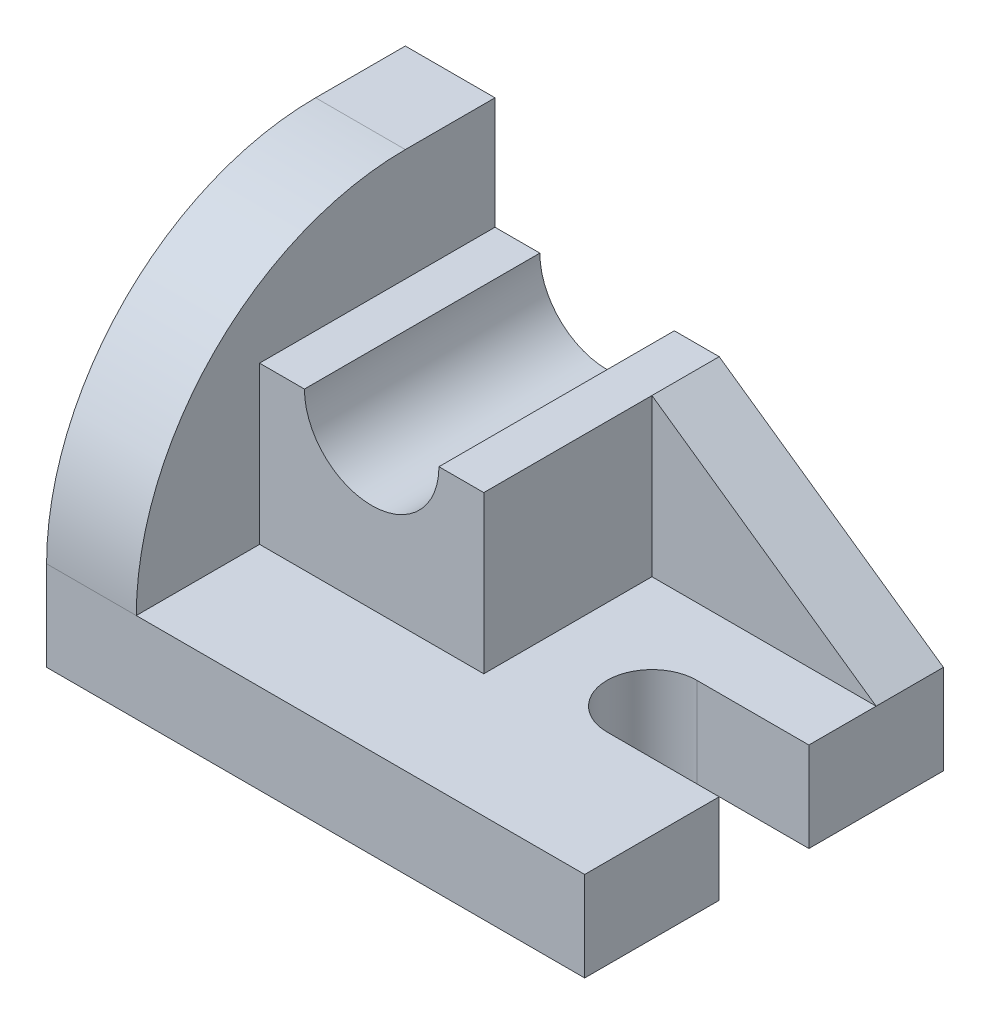
ISO-10303-21;
HEADER;
FILE_DESCRIPTION(('STEP AP214'),'2;1');
FILE_NAME('part.step','',(''),(''),'','','');
FILE_SCHEMA(('AUTOMOTIVE_DESIGN { 1 0 10303 214 1 1 1 1 }'));
ENDSEC;
DATA;
#1=APPLICATION_CONTEXT('core data for automotive mechanical design processes');
#2=APPLICATION_PROTOCOL_DEFINITION('international standard','automotive_design',2000,#1);
#3=PRODUCT_CONTEXT('',#1,'mechanical');
#4=PRODUCT('Part','Part','',(#3));
#5=PRODUCT_RELATED_PRODUCT_CATEGORY('part','',(#4));
#6=PRODUCT_DEFINITION_FORMATION('','',#4);
#7=PRODUCT_DEFINITION_CONTEXT('part definition',#1,'design');
#8=PRODUCT_DEFINITION('design','',#6,#7);
#9=PRODUCT_DEFINITION_SHAPE('','',#8);
#10=(LENGTH_UNIT() NAMED_UNIT(*) SI_UNIT(.MILLI.,.METRE.));
#11=(NAMED_UNIT(*) PLANE_ANGLE_UNIT() SI_UNIT($,.RADIAN.));
#12=(NAMED_UNIT(*) SI_UNIT($,.STERADIAN.) SOLID_ANGLE_UNIT());
#13=UNCERTAINTY_MEASURE_WITH_UNIT(LENGTH_MEASURE(1.E-05),#10,'distance_accuracy_value','');
#14=(GEOMETRIC_REPRESENTATION_CONTEXT(3) GLOBAL_UNCERTAINTY_ASSIGNED_CONTEXT((#13)) GLOBAL_UNIT_ASSIGNED_CONTEXT((#10,
#11,#12)) REPRESENTATION_CONTEXT('',''));
#15=CARTESIAN_POINT('',(0.,0.,0.));
#16=DIRECTION('',(0.,0.,1.));
#17=DIRECTION('',(1.,0.,0.));
#18=AXIS2_PLACEMENT_3D('',#15,#16,#17);
#19=CARTESIAN_POINT('',(0.,16.,0.));
#20=DIRECTION('',(0.,1.,0.));
#21=DIRECTION('',(0.,0.,1.));
#22=AXIS2_PLACEMENT_3D('',#19,#20,#21);
#23=PLANE('',#22);
#24=DIRECTION('',(0.,0.,1.));
#25=VECTOR('',#24,1.);
#26=CARTESIAN_POINT('',(48.,16.,0.));
#27=LINE('',#26,#25);
#28=CARTESIAN_POINT('',(48.,16.,-20.));
#29=VERTEX_POINT('',#28);
#30=CARTESIAN_POINT('',(48.,16.,-8.));
#31=VERTEX_POINT('',#30);
#32=EDGE_CURVE('E220',#29,#31,#27,.T.);
#33=ORIENTED_EDGE('',*,*,#32,.F.);
#34=DIRECTION('',(-1.,0.,0.));
#35=VECTOR('',#34,1.);
#36=CARTESIAN_POINT('',(8.,16.,-20.));
#37=LINE('',#36,#35);
#38=CARTESIAN_POINT('',(8.,16.,-20.));
#39=VERTEX_POINT('',#38);
#40=EDGE_CURVE('E206',#29,#39,#37,.T.);
#41=ORIENTED_EDGE('',*,*,#40,.T.);
#42=DIRECTION('',(0.,0.,1.));
#43=VECTOR('',#42,1.);
#44=CARTESIAN_POINT('',(8.,16.,-32.));
#45=LINE('',#44,#43);
#46=CARTESIAN_POINT('',(8.,16.,10.));
#47=VERTEX_POINT('',#46);
#48=EDGE_CURVE('E346',#39,#47,#45,.T.);
#49=ORIENTED_EDGE('',*,*,#48,.T.);
#50=DIRECTION('',(-1.,0.,0.));
#51=VECTOR('',#50,1.);
#52=CARTESIAN_POINT('',(8.,16.,10.));
#53=LINE('',#52,#51);
#54=CARTESIAN_POINT('',(-32.,16.,10.));
#55=VERTEX_POINT('',#54);
#56=EDGE_CURVE('E358',#47,#55,#53,.T.);
#57=ORIENTED_EDGE('',*,*,#56,.T.);
#58=DIRECTION('',(0.,0.,1.));
#59=VECTOR('',#58,1.);
#60=CARTESIAN_POINT('',(-32.,16.,-32.));
#61=LINE('',#60,#59);
#62=CARTESIAN_POINT('',(-32.,16.,32.));
#63=VERTEX_POINT('',#62);
#64=EDGE_CURVE('E300',#55,#63,#61,.T.);
#65=ORIENTED_EDGE('',*,*,#64,.T.);
#66=DIRECTION('',(1.,0.,0.));
#67=VECTOR('',#66,1.);
#68=CARTESIAN_POINT('',(0.,16.,32.));
#69=LINE('',#68,#67);
#70=CARTESIAN_POINT('',(48.,16.,32.));
#71=VERTEX_POINT('',#70);
#72=EDGE_CURVE('E229',#63,#71,#69,.T.);
#73=ORIENTED_EDGE('',*,*,#72,.T.);
#74=CARTESIAN_POINT('',(48.,16.,8.));
#75=VERTEX_POINT('',#74);
#76=EDGE_CURVE('E221',#75,#71,#27,.T.);
#77=ORIENTED_EDGE('',*,*,#76,.F.);
#78=DIRECTION('',(-1.,0.,0.));
#79=VECTOR('',#78,1.);
#80=CARTESIAN_POINT('',(0.,16.,8.00000000000001));
#81=LINE('',#80,#79);
#82=CARTESIAN_POINT('',(28.,16.,8.));
#83=VERTEX_POINT('',#82);
#84=EDGE_CURVE('E232',#75,#83,#81,.T.);
#85=ORIENTED_EDGE('',*,*,#84,.T.);
#86=CARTESIAN_POINT('',(28.,16.,0.));
#87=DIRECTION('',(0.,1.,0.));
#88=DIRECTION('',(0.,0.,1.));
#89=AXIS2_PLACEMENT_3D('',#86,#87,#88);
#90=CIRCLE('',#89,8.);
#91=CARTESIAN_POINT('',(28.,16.,-8.));
#92=VERTEX_POINT('',#91);
#93=EDGE_CURVE('E264',#92,#83,#90,.T.);
#94=ORIENTED_EDGE('',*,*,#93,.F.);
#95=DIRECTION('',(-1.,0.,0.));
#96=VECTOR('',#95,1.);
#97=CARTESIAN_POINT('',(0.,16.,-8.));
#98=LINE('',#97,#96);
#99=EDGE_CURVE('E219',#31,#92,#98,.T.);
#100=ORIENTED_EDGE('',*,*,#99,.F.);
#101=EDGE_LOOP('',(#33,#41,#49,#57,#65,#73,#77,#85,#94,#100));
#102=FACE_BOUND('',#101,.T.);
#103=ADVANCED_FACE('F81',(#102),#23,.T.);
#104=CARTESIAN_POINT('',(8.,44.,-32.));
#105=DIRECTION('',(0.,-1.,0.));
#106=DIRECTION('',(0.,0.,-1.));
#107=AXIS2_PLACEMENT_3D('',#104,#105,#106);
#108=PLANE('',#107);
#109=DIRECTION('',(-1.,0.,0.));
#110=VECTOR('',#109,1.);
#111=CARTESIAN_POINT('',(8.,44.,-32.));
#112=LINE('',#111,#110);
#113=CARTESIAN_POINT('',(8.,44.,-32.));
#114=VERTEX_POINT('',#113);
#115=CARTESIAN_POINT('',(0.,44.,-32.));
#116=VERTEX_POINT('',#115);
#117=EDGE_CURVE('E334',#114,#116,#112,.T.);
#118=ORIENTED_EDGE('',*,*,#117,.T.);
#119=DIRECTION('',(0.,0.,1.));
#120=VECTOR('',#119,1.);
#121=CARTESIAN_POINT('',(0.,44.,-59.));
#122=LINE('',#121,#120);
#123=CARTESIAN_POINT('',(0.,44.,10.));
#124=VERTEX_POINT('',#123);
#125=EDGE_CURVE('E339',#116,#124,#122,.T.);
#126=ORIENTED_EDGE('',*,*,#125,.T.);
#127=DIRECTION('',(-1.,0.,0.));
#128=VECTOR('',#127,1.);
#129=CARTESIAN_POINT('',(8.,44.,10.));
#130=LINE('',#129,#128);
#131=CARTESIAN_POINT('',(8.,44.,10.));
#132=VERTEX_POINT('',#131);
#133=EDGE_CURVE('E356',#132,#124,#130,.T.);
#134=ORIENTED_EDGE('',*,*,#133,.F.);
#135=DIRECTION('',(0.,0.,1.));
#136=VECTOR('',#135,1.);
#137=CARTESIAN_POINT('',(8.,44.,-32.));
#138=LINE('',#137,#136);
#139=CARTESIAN_POINT('',(8.,44.,-20.));
#140=VERTEX_POINT('',#139);
#141=EDGE_CURVE('E341',#140,#132,#138,.T.);
#142=ORIENTED_EDGE('',*,*,#141,.F.);
#143=EDGE_CURVE('E204',#114,#140,#138,.T.);
#144=ORIENTED_EDGE('',*,*,#143,.F.);
#145=EDGE_LOOP('',(#118,#126,#134,#142,#144));
#146=FACE_BOUND('',#145,.T.);
#147=ADVANCED_FACE('F380',(#146),#108,.F.);
#148=CARTESIAN_POINT('',(28.,16.,0.));
#149=DIRECTION('',(0.,-1.,0.));
#150=DIRECTION('',(0.,0.,-1.));
#151=AXIS2_PLACEMENT_3D('',#148,#149,#150);
#152=CYLINDRICAL_SURFACE('',#151,8.);
#153=CARTESIAN_POINT('',(28.,0.,0.));
#154=DIRECTION('',(0.,1.,0.));
#155=DIRECTION('',(0.,0.,1.));
#156=AXIS2_PLACEMENT_3D('',#153,#154,#155);
#157=CIRCLE('',#156,8.);
#158=CARTESIAN_POINT('',(28.,0.,-8.));
#159=VERTEX_POINT('',#158);
#160=CARTESIAN_POINT('',(28.,0.,8.));
#161=VERTEX_POINT('',#160);
#162=EDGE_CURVE('E241',#159,#161,#157,.T.);
#163=ORIENTED_EDGE('',*,*,#162,.F.);
#164=DIRECTION('',(0.,-1.,0.));
#165=VECTOR('',#164,1.);
#166=CARTESIAN_POINT('',(28.,16.,-8.));
#167=LINE('',#166,#165);
#168=EDGE_CURVE('E280',#92,#159,#167,.T.);
#169=ORIENTED_EDGE('',*,*,#168,.F.);
#170=ORIENTED_EDGE('',*,*,#93,.T.);
#171=DIRECTION('',(0.,-1.,0.));
#172=VECTOR('',#171,1.);
#173=CARTESIAN_POINT('',(28.,16.,8.));
#174=LINE('',#173,#172);
#175=EDGE_CURVE('E237',#83,#161,#174,.T.);
#176=ORIENTED_EDGE('',*,*,#175,.T.);
#177=EDGE_LOOP('',(#163,#169,#170,#176));
#178=FACE_BOUND('',#177,.T.);
#179=ADVANCED_FACE('F392',(#178),#152,.F.);
#180=CARTESIAN_POINT('',(0.,16.,-8.));
#181=DIRECTION('',(0.,0.,1.));
#182=DIRECTION('',(1.,0.,0.));
#183=AXIS2_PLACEMENT_3D('',#180,#181,#182);
#184=PLANE('',#183);
#185=DIRECTION('',(-1.,0.,0.));
#186=VECTOR('',#185,1.);
#187=CARTESIAN_POINT('',(0.,0.,-8.));
#188=LINE('',#187,#186);
#189=CARTESIAN_POINT('',(48.,0.,-8.));
#190=VERTEX_POINT('',#189);
#191=EDGE_CURVE('E248',#190,#159,#188,.T.);
#192=ORIENTED_EDGE('',*,*,#191,.F.);
#193=DIRECTION('',(0.,-1.,0.));
#194=VECTOR('',#193,1.);
#195=CARTESIAN_POINT('',(48.,16.,-8.));
#196=LINE('',#195,#194);
#197=EDGE_CURVE('E274',#31,#190,#196,.T.);
#198=ORIENTED_EDGE('',*,*,#197,.F.);
#199=ORIENTED_EDGE('',*,*,#99,.T.);
#200=ORIENTED_EDGE('',*,*,#168,.T.);
#201=EDGE_LOOP('',(#192,#198,#199,#200));
#202=FACE_BOUND('',#201,.T.);
#203=ADVANCED_FACE('F321',(#202),#184,.T.);
#204=CARTESIAN_POINT('',(48.,16.,0.));
#205=DIRECTION('',(1.,0.,0.));
#206=DIRECTION('',(0.,0.,-1.));
#207=AXIS2_PLACEMENT_3D('',#204,#205,#206);
#208=PLANE('',#207);
#209=DIRECTION('',(0.,0.,1.));
#210=VECTOR('',#209,1.);
#211=CARTESIAN_POINT('',(48.,0.,0.));
#212=LINE('',#211,#210);
#213=CARTESIAN_POINT('',(48.,0.,-32.));
#214=VERTEX_POINT('',#213);
#215=EDGE_CURVE('E246',#214,#190,#212,.T.);
#216=ORIENTED_EDGE('',*,*,#215,.F.);
#217=DIRECTION('',(0.,-1.,0.));
#218=VECTOR('',#217,1.);
#219=CARTESIAN_POINT('',(48.,16.,-32.));
#220=LINE('',#219,#218);
#221=CARTESIAN_POINT('',(48.,16.,-32.));
#222=VERTEX_POINT('',#221);
#223=EDGE_CURVE('E226',#222,#214,#220,.T.);
#224=ORIENTED_EDGE('',*,*,#223,.F.);
#225=EDGE_CURVE('E203',#222,#29,#27,.T.);
#226=ORIENTED_EDGE('',*,*,#225,.T.);
#227=ORIENTED_EDGE('',*,*,#32,.T.);
#228=ORIENTED_EDGE('',*,*,#197,.T.);
#229=EDGE_LOOP('',(#216,#224,#226,#227,#228));
#230=FACE_BOUND('',#229,.T.);
#231=ADVANCED_FACE('F230',(#230),#208,.T.);
#232=CARTESIAN_POINT('',(0.,16.,-32.));
#233=DIRECTION('',(0.,0.,-1.));
#234=DIRECTION('',(-1.,0.,0.));
#235=AXIS2_PLACEMENT_3D('',#232,#233,#234);
#236=PLANE('',#235);
#237=DIRECTION('',(0.819231920519041,-0.573462344363328,0.));
#238=VECTOR('',#237,1.);
#239=CARTESIAN_POINT('',(8.,44.,-32.));
#240=LINE('',#239,#238);
#241=EDGE_CURVE('E332',#114,#222,#240,.T.);
#242=ORIENTED_EDGE('',*,*,#241,.T.);
#243=ORIENTED_EDGE('',*,*,#223,.T.);
#244=DIRECTION('',(1.,0.,0.));
#245=VECTOR('',#244,1.);
#246=CARTESIAN_POINT('',(0.,0.,-32.));
#247=LINE('',#246,#245);
#248=CARTESIAN_POINT('',(-48.,0.,-32.));
#249=VERTEX_POINT('',#248);
#250=EDGE_CURVE('E251',#249,#214,#247,.T.);
#251=ORIENTED_EDGE('',*,*,#250,.F.);
#252=DIRECTION('',(0.,-1.,0.));
#253=VECTOR('',#252,1.);
#254=CARTESIAN_POINT('',(-48.,16.,-32.));
#255=LINE('',#254,#253);
#256=CARTESIAN_POINT('',(-48.,64.,-32.));
#257=VERTEX_POINT('',#256);
#258=EDGE_CURVE('E275',#257,#249,#255,.T.);
#259=ORIENTED_EDGE('',*,*,#258,.F.);
#260=DIRECTION('',(-1.,0.,0.));
#261=VECTOR('',#260,1.);
#262=CARTESIAN_POINT('',(-48.,64.,-32.));
#263=LINE('',#262,#261);
#264=CARTESIAN_POINT('',(-32.,64.,-32.));
#265=VERTEX_POINT('',#264);
#266=EDGE_CURVE('E313',#265,#257,#263,.T.);
#267=ORIENTED_EDGE('',*,*,#266,.F.);
#268=DIRECTION('',(0.,1.,0.));
#269=VECTOR('',#268,1.);
#270=CARTESIAN_POINT('',(-32.,16.,-32.));
#271=LINE('',#270,#269);
#272=CARTESIAN_POINT('',(-32.,44.,-32.));
#273=VERTEX_POINT('',#272);
#274=EDGE_CURVE('E362',#273,#265,#271,.T.);
#275=ORIENTED_EDGE('',*,*,#274,.F.);
#276=CARTESIAN_POINT('',(-24.,44.,-32.));
#277=VERTEX_POINT('',#276);
#278=EDGE_CURVE('E348',#277,#273,#112,.T.);
#279=ORIENTED_EDGE('',*,*,#278,.F.);
#280=CARTESIAN_POINT('',(-12.,44.,-32.));
#281=DIRECTION('',(0.,0.,-1.));
#282=DIRECTION('',(-1.,0.,0.));
#283=AXIS2_PLACEMENT_3D('',#280,#281,#282);
#284=CIRCLE('',#283,12.);
#285=EDGE_CURVE('E108',#116,#277,#284,.T.);
#286=ORIENTED_EDGE('',*,*,#285,.F.);
#287=ORIENTED_EDGE('',*,*,#117,.F.);
#288=EDGE_LOOP('',(#242,#243,#251,#259,#267,#275,#279,#286,#287));
#289=FACE_BOUND('',#288,.T.);
#290=ADVANCED_FACE('F328',(#289),#236,.T.);
#291=CARTESIAN_POINT('',(-48.,16.,0.));
#292=DIRECTION('',(1.,0.,0.));
#293=DIRECTION('',(0.,0.,-1.));
#294=AXIS2_PLACEMENT_3D('',#291,#292,#293);
#295=PLANE('',#294);
#296=DIRECTION('',(0.,-1.,0.));
#297=VECTOR('',#296,1.);
#298=CARTESIAN_POINT('',(-48.,16.,32.));
#299=LINE('',#298,#297);
#300=CARTESIAN_POINT('',(-48.,16.,32.));
#301=VERTEX_POINT('',#300);
#302=CARTESIAN_POINT('',(-48.,0.,32.));
#303=VERTEX_POINT('',#302);
#304=EDGE_CURVE('E269',#301,#303,#299,.T.);
#305=ORIENTED_EDGE('',*,*,#304,.F.);
#306=CARTESIAN_POINT('',(-48.,16.,-16.));
#307=DIRECTION('',(1.,0.,0.));
#308=DIRECTION('',(0.,0.,-1.));
#309=AXIS2_PLACEMENT_3D('',#306,#307,#308);
#310=CIRCLE('',#309,48.);
#311=CARTESIAN_POINT('',(-48.,64.,-16.));
#312=VERTEX_POINT('',#311);
#313=EDGE_CURVE('E285',#301,#312,#310,.F.);
#314=ORIENTED_EDGE('',*,*,#313,.T.);
#315=DIRECTION('',(0.,0.,1.));
#316=VECTOR('',#315,1.);
#317=CARTESIAN_POINT('',(-48.,64.,-32.));
#318=LINE('',#317,#316);
#319=EDGE_CURVE('E249',#257,#312,#318,.T.);
#320=ORIENTED_EDGE('',*,*,#319,.F.);
#321=ORIENTED_EDGE('',*,*,#258,.T.);
#322=DIRECTION('',(0.,0.,1.));
#323=VECTOR('',#322,1.);
#324=CARTESIAN_POINT('',(-48.,0.,0.));
#325=LINE('',#324,#323);
#326=EDGE_CURVE('E260',#249,#303,#325,.T.);
#327=ORIENTED_EDGE('',*,*,#326,.T.);
#328=EDGE_LOOP('',(#305,#314,#320,#321,#327));
#329=FACE_BOUND('',#328,.T.);
#330=ADVANCED_FACE('F307',(#329),#295,.F.);
#331=CARTESIAN_POINT('',(0.,16.,32.));
#332=DIRECTION('',(0.,0.,-1.));
#333=DIRECTION('',(-1.,0.,0.));
#334=AXIS2_PLACEMENT_3D('',#331,#332,#333);
#335=PLANE('',#334);
#336=ORIENTED_EDGE('',*,*,#72,.F.);
#337=DIRECTION('',(-1.,0.,0.));
#338=VECTOR('',#337,1.);
#339=CARTESIAN_POINT('',(-48.,16.,32.));
#340=LINE('',#339,#338);
#341=EDGE_CURVE('E276',#63,#301,#340,.T.);
#342=ORIENTED_EDGE('',*,*,#341,.T.);
#343=ORIENTED_EDGE('',*,*,#304,.T.);
#344=DIRECTION('',(1.,0.,0.));
#345=VECTOR('',#344,1.);
#346=CARTESIAN_POINT('',(0.,0.,32.));
#347=LINE('',#346,#345);
#348=CARTESIAN_POINT('',(48.,0.,32.));
#349=VERTEX_POINT('',#348);
#350=EDGE_CURVE('E257',#303,#349,#347,.T.);
#351=ORIENTED_EDGE('',*,*,#350,.T.);
#352=DIRECTION('',(0.,-1.,0.));
#353=VECTOR('',#352,1.);
#354=CARTESIAN_POINT('',(48.,16.,32.));
#355=LINE('',#354,#353);
#356=EDGE_CURVE('E268',#71,#349,#355,.T.);
#357=ORIENTED_EDGE('',*,*,#356,.F.);
#358=EDGE_LOOP('',(#336,#342,#343,#351,#357));
#359=FACE_BOUND('',#358,.T.);
#360=ADVANCED_FACE('F302',(#359),#335,.F.);
#361=CARTESIAN_POINT('',(48.,0.,8.));
#362=VERTEX_POINT('',#361);
#363=EDGE_CURVE('E255',#362,#349,#212,.T.);
#364=ORIENTED_EDGE('',*,*,#363,.F.);
#365=DIRECTION('',(0.,-1.,0.));
#366=VECTOR('',#365,1.);
#367=CARTESIAN_POINT('',(48.,16.,8.));
#368=LINE('',#367,#366);
#369=EDGE_CURVE('E238',#75,#362,#368,.T.);
#370=ORIENTED_EDGE('',*,*,#369,.F.);
#371=ORIENTED_EDGE('',*,*,#76,.T.);
#372=ORIENTED_EDGE('',*,*,#356,.T.);
#373=EDGE_LOOP('',(#364,#370,#371,#372));
#374=FACE_BOUND('',#373,.T.);
#375=ADVANCED_FACE('F403',(#374),#208,.T.);
#376=CARTESIAN_POINT('',(0.,16.,8.00000000000001));
#377=DIRECTION('',(0.,0.,1.));
#378=DIRECTION('',(1.,0.,0.));
#379=AXIS2_PLACEMENT_3D('',#376,#377,#378);
#380=PLANE('',#379);
#381=DIRECTION('',(-1.,0.,0.));
#382=VECTOR('',#381,1.);
#383=CARTESIAN_POINT('',(0.,0.,8.00000000000001));
#384=LINE('',#383,#382);
#385=EDGE_CURVE('E263',#362,#161,#384,.T.);
#386=ORIENTED_EDGE('',*,*,#385,.T.);
#387=ORIENTED_EDGE('',*,*,#175,.F.);
#388=ORIENTED_EDGE('',*,*,#84,.F.);
#389=ORIENTED_EDGE('',*,*,#369,.T.);
#390=EDGE_LOOP('',(#386,#387,#388,#389));
#391=FACE_BOUND('',#390,.T.);
#392=ADVANCED_FACE('F405',(#391),#380,.F.);
#393=CARTESIAN_POINT('',(0.,0.,0.));
#394=DIRECTION('',(0.,1.,0.));
#395=DIRECTION('',(0.,0.,1.));
#396=AXIS2_PLACEMENT_3D('',#393,#394,#395);
#397=PLANE('',#396);
#398=ORIENTED_EDGE('',*,*,#162,.T.);
#399=ORIENTED_EDGE('',*,*,#385,.F.);
#400=ORIENTED_EDGE('',*,*,#363,.T.);
#401=ORIENTED_EDGE('',*,*,#350,.F.);
#402=ORIENTED_EDGE('',*,*,#326,.F.);
#403=ORIENTED_EDGE('',*,*,#250,.T.);
#404=ORIENTED_EDGE('',*,*,#215,.T.);
#405=ORIENTED_EDGE('',*,*,#191,.T.);
#406=EDGE_LOOP('',(#398,#399,#400,#401,#402,#403,#404,#405));
#407=FACE_BOUND('',#406,.T.);
#408=ADVANCED_FACE('F326',(#407),#397,.F.);
#409=CARTESIAN_POINT('',(-48.,64.,-32.));
#410=DIRECTION('',(0.,1.,0.));
#411=DIRECTION('',(0.,0.,1.));
#412=AXIS2_PLACEMENT_3D('',#409,#410,#411);
#413=PLANE('',#412);
#414=ORIENTED_EDGE('',*,*,#319,.T.);
#415=DIRECTION('',(-1.,0.,0.));
#416=VECTOR('',#415,1.);
#417=CARTESIAN_POINT('',(-32.,64.,-16.));
#418=LINE('',#417,#416);
#419=CARTESIAN_POINT('',(-32.,64.,-16.));
#420=VERTEX_POINT('',#419);
#421=EDGE_CURVE('E281',#312,#420,#418,.F.);
#422=ORIENTED_EDGE('',*,*,#421,.T.);
#423=DIRECTION('',(0.,0.,1.));
#424=VECTOR('',#423,1.);
#425=CARTESIAN_POINT('',(-32.,64.,-32.));
#426=LINE('',#425,#424);
#427=EDGE_CURVE('E296',#265,#420,#426,.T.);
#428=ORIENTED_EDGE('',*,*,#427,.F.);
#429=ORIENTED_EDGE('',*,*,#266,.T.);
#430=EDGE_LOOP('',(#414,#422,#428,#429));
#431=FACE_BOUND('',#430,.T.);
#432=ADVANCED_FACE('F310',(#431),#413,.T.);
#433=CARTESIAN_POINT('',(-32.,16.,-32.));
#434=DIRECTION('',(1.,0.,0.));
#435=DIRECTION('',(0.,0.,-1.));
#436=AXIS2_PLACEMENT_3D('',#433,#434,#435);
#437=PLANE('',#436);
#438=DIRECTION('',(0.,0.,1.));
#439=VECTOR('',#438,1.);
#440=CARTESIAN_POINT('',(-32.,44.,-32.));
#441=LINE('',#440,#439);
#442=CARTESIAN_POINT('',(-32.,44.,10.));
#443=VERTEX_POINT('',#442);
#444=EDGE_CURVE('E344',#273,#443,#441,.T.);
#445=ORIENTED_EDGE('',*,*,#444,.F.);
#446=ORIENTED_EDGE('',*,*,#274,.T.);
#447=ORIENTED_EDGE('',*,*,#427,.T.);
#448=CARTESIAN_POINT('',(-32.,16.,-16.));
#449=DIRECTION('',(1.,0.,0.));
#450=DIRECTION('',(0.,0.,-1.));
#451=AXIS2_PLACEMENT_3D('',#448,#449,#450);
#452=CIRCLE('',#451,48.);
#453=EDGE_CURVE('E90',#420,#63,#452,.T.);
#454=ORIENTED_EDGE('',*,*,#453,.T.);
#455=ORIENTED_EDGE('',*,*,#64,.F.);
#456=DIRECTION('',(0.,1.,0.));
#457=VECTOR('',#456,1.);
#458=CARTESIAN_POINT('',(-32.,16.,10.));
#459=LINE('',#458,#457);
#460=EDGE_CURVE('E351',#55,#443,#459,.T.);
#461=ORIENTED_EDGE('',*,*,#460,.T.);
#462=EDGE_LOOP('',(#445,#446,#447,#454,#455,#461));
#463=FACE_BOUND('',#462,.T.);
#464=ADVANCED_FACE('F293',(#463),#437,.T.);
#465=CARTESIAN_POINT('',(0.,16.,-16.));
#466=DIRECTION('',(1.,0.,0.));
#467=DIRECTION('',(0.,0.,-1.));
#468=AXIS2_PLACEMENT_3D('',#465,#466,#467);
#469=CYLINDRICAL_SURFACE('',#468,48.);
#470=ORIENTED_EDGE('',*,*,#453,.F.);
#471=ORIENTED_EDGE('',*,*,#421,.F.);
#472=ORIENTED_EDGE('',*,*,#313,.F.);
#473=ORIENTED_EDGE('',*,*,#341,.F.);
#474=EDGE_LOOP('',(#470,#471,#472,#473));
#475=FACE_BOUND('',#474,.T.);
#476=ADVANCED_FACE('F87',(#475),#469,.T.);
#477=CARTESIAN_POINT('',(-24.,44.,10.));
#478=VERTEX_POINT('',#477);
#479=EDGE_CURVE('E360',#478,#443,#130,.T.);
#480=ORIENTED_EDGE('',*,*,#479,.F.);
#481=DIRECTION('',(0.,0.,1.));
#482=VECTOR('',#481,1.);
#483=CARTESIAN_POINT('',(-24.,44.,-59.));
#484=LINE('',#483,#482);
#485=EDGE_CURVE('E212',#478,#277,#484,.F.);
#486=ORIENTED_EDGE('',*,*,#485,.T.);
#487=ORIENTED_EDGE('',*,*,#278,.T.);
#488=ORIENTED_EDGE('',*,*,#444,.T.);
#489=EDGE_LOOP('',(#480,#486,#487,#488));
#490=FACE_BOUND('',#489,.T.);
#491=ADVANCED_FACE('F370',(#490),#108,.F.);
#492=CARTESIAN_POINT('',(8.,16.,10.));
#493=DIRECTION('',(0.,0.,1.));
#494=DIRECTION('',(1.,0.,0.));
#495=AXIS2_PLACEMENT_3D('',#492,#493,#494);
#496=PLANE('',#495);
#497=CARTESIAN_POINT('',(-12.,44.,10.));
#498=DIRECTION('',(0.,0.,1.));
#499=DIRECTION('',(1.,0.,0.));
#500=AXIS2_PLACEMENT_3D('',#497,#498,#499);
#501=CIRCLE('',#500,12.);
#502=EDGE_CURVE('E12',#478,#124,#501,.T.);
#503=ORIENTED_EDGE('',*,*,#502,.F.);
#504=ORIENTED_EDGE('',*,*,#479,.T.);
#505=ORIENTED_EDGE('',*,*,#460,.F.);
#506=ORIENTED_EDGE('',*,*,#56,.F.);
#507=DIRECTION('',(0.,1.,0.));
#508=VECTOR('',#507,1.);
#509=CARTESIAN_POINT('',(8.,16.,10.));
#510=LINE('',#509,#508);
#511=EDGE_CURVE('E345',#47,#132,#510,.T.);
#512=ORIENTED_EDGE('',*,*,#511,.T.);
#513=ORIENTED_EDGE('',*,*,#133,.T.);
#514=EDGE_LOOP('',(#503,#504,#505,#506,#512,#513));
#515=FACE_BOUND('',#514,.T.);
#516=ADVANCED_FACE('F371',(#515),#496,.T.);
#517=CARTESIAN_POINT('',(8.,0.,0.));
#518=DIRECTION('',(-1.,0.,0.));
#519=DIRECTION('',(0.,0.,1.));
#520=AXIS2_PLACEMENT_3D('',#517,#518,#519);
#521=PLANE('',#520);
#522=ORIENTED_EDGE('',*,*,#48,.F.);
#523=DIRECTION('',(0.,1.,0.));
#524=VECTOR('',#523,1.);
#525=CARTESIAN_POINT('',(8.,44.,-20.));
#526=LINE('',#525,#524);
#527=EDGE_CURVE('E210',#39,#140,#526,.T.);
#528=ORIENTED_EDGE('',*,*,#527,.T.);
#529=ORIENTED_EDGE('',*,*,#141,.T.);
#530=ORIENTED_EDGE('',*,*,#511,.F.);
#531=EDGE_LOOP('',(#522,#528,#529,#530));
#532=FACE_BOUND('',#531,.T.);
#533=ADVANCED_FACE('F377',(#532),#521,.F.);
#534=CARTESIAN_POINT('',(-12.,44.,-59.));
#535=DIRECTION('',(0.,0.,1.));
#536=DIRECTION('',(1.,0.,0.));
#537=AXIS2_PLACEMENT_3D('',#534,#535,#536);
#538=CYLINDRICAL_SURFACE('',#537,12.);
#539=ORIENTED_EDGE('',*,*,#285,.T.);
#540=ORIENTED_EDGE('',*,*,#485,.F.);
#541=ORIENTED_EDGE('',*,*,#502,.T.);
#542=ORIENTED_EDGE('',*,*,#125,.F.);
#543=EDGE_LOOP('',(#539,#540,#541,#542));
#544=FACE_BOUND('',#543,.T.);
#545=ADVANCED_FACE('F369',(#544),#538,.F.);
#546=CARTESIAN_POINT('',(8.,44.,-20.));
#547=DIRECTION('',(0.573462344363328,0.81923192051904,0.));
#548=DIRECTION('',(-0.819231920519041,0.573462344363328,0.));
#549=AXIS2_PLACEMENT_3D('',#546,#547,#548);
#550=PLANE('',#549);
#551=ORIENTED_EDGE('',*,*,#241,.F.);
#552=ORIENTED_EDGE('',*,*,#143,.T.);
#553=DIRECTION('',(0.819231920519041,-0.573462344363328,0.));
#554=VECTOR('',#553,1.);
#555=CARTESIAN_POINT('',(8.,44.,-20.));
#556=LINE('',#555,#554);
#557=EDGE_CURVE('E101',#140,#29,#556,.T.);
#558=ORIENTED_EDGE('',*,*,#557,.T.);
#559=ORIENTED_EDGE('',*,*,#225,.F.);
#560=EDGE_LOOP('',(#551,#552,#558,#559));
#561=FACE_BOUND('',#560,.T.);
#562=ADVANCED_FACE('F200',(#561),#550,.T.);
#563=CARTESIAN_POINT('',(0.,0.,-20.));
#564=DIRECTION('',(0.,0.,1.));
#565=DIRECTION('',(1.,0.,0.));
#566=AXIS2_PLACEMENT_3D('',#563,#564,#565);
#567=PLANE('',#566);
#568=ORIENTED_EDGE('',*,*,#527,.F.);
#569=ORIENTED_EDGE('',*,*,#40,.F.);
#570=ORIENTED_EDGE('',*,*,#557,.F.);
#571=EDGE_LOOP('',(#568,#569,#570));
#572=FACE_BOUND('',#571,.T.);
#573=ADVANCED_FACE('F211',(#572),#567,.T.);
#574=CLOSED_SHELL('',(#103,#147,#179,#203,#231,#290,#330,#360,#375,#392,#408,#432,#464,#476,
#491,#516,#533,#545,#562,#573));
#575=MANIFOLD_SOLID_BREP('B2',#574);
#576=ADVANCED_BREP_SHAPE_REPRESENTATION('',(#18,#575),#14);
#577=SHAPE_DEFINITION_REPRESENTATION(#9,#576);
ENDSEC;
END-ISO-10303-21;
